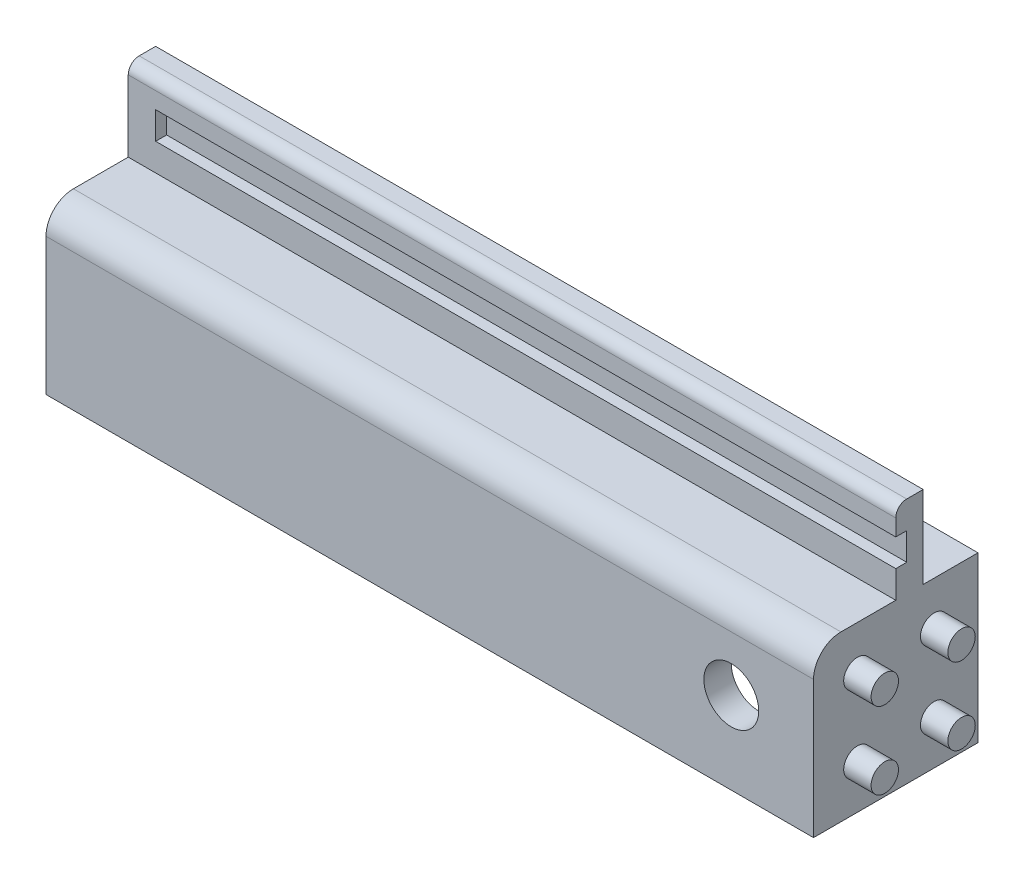
ISO-10303-21;
HEADER;
FILE_DESCRIPTION(('STEP AP214'),'2;1');
FILE_NAME('part.step','',(''),(''),'','','');
FILE_SCHEMA(('AUTOMOTIVE_DESIGN { 1 0 10303 214 1 1 1 1 }'));
ENDSEC;
DATA;
#1=APPLICATION_CONTEXT('core data for automotive mechanical design processes');
#2=APPLICATION_PROTOCOL_DEFINITION('international standard','automotive_design',2000,#1);
#3=PRODUCT_CONTEXT('',#1,'mechanical');
#4=PRODUCT('Part','Part','',(#3));
#5=PRODUCT_RELATED_PRODUCT_CATEGORY('part','',(#4));
#6=PRODUCT_DEFINITION_FORMATION('','',#4);
#7=PRODUCT_DEFINITION_CONTEXT('part definition',#1,'design');
#8=PRODUCT_DEFINITION('design','',#6,#7);
#9=PRODUCT_DEFINITION_SHAPE('','',#8);
#10=(LENGTH_UNIT() NAMED_UNIT(*) SI_UNIT(.MILLI.,.METRE.));
#11=(NAMED_UNIT(*) PLANE_ANGLE_UNIT() SI_UNIT($,.RADIAN.));
#12=(NAMED_UNIT(*) SI_UNIT($,.STERADIAN.) SOLID_ANGLE_UNIT());
#13=UNCERTAINTY_MEASURE_WITH_UNIT(LENGTH_MEASURE(1.E-05),#10,'distance_accuracy_value','');
#14=(GEOMETRIC_REPRESENTATION_CONTEXT(3) GLOBAL_UNCERTAINTY_ASSIGNED_CONTEXT((#13)) GLOBAL_UNIT_ASSIGNED_CONTEXT((#10,
#11,#12)) REPRESENTATION_CONTEXT('',''));
#15=CARTESIAN_POINT('',(0.,0.,0.));
#16=DIRECTION('',(0.,0.,1.));
#17=DIRECTION('',(1.,0.,0.));
#18=AXIS2_PLACEMENT_3D('',#15,#16,#17);
#19=CARTESIAN_POINT('',(0.,30.,0.));
#20=DIRECTION('',(0.,1.,0.));
#21=DIRECTION('',(0.,0.,1.));
#22=AXIS2_PLACEMENT_3D('',#19,#20,#21);
#23=PLANE('',#22);
#24=DIRECTION('',(-1.,0.,0.));
#25=VECTOR('',#24,1.);
#26=CARTESIAN_POINT('',(0.,30.,-20.));
#27=LINE('',#26,#25);
#28=CARTESIAN_POINT('',(140.,30.,-20.));
#29=VERTEX_POINT('',#28);
#30=CARTESIAN_POINT('',(0.,30.,-20.));
#31=VERTEX_POINT('',#30);
#32=EDGE_CURVE('E228',#29,#31,#27,.T.);
#33=ORIENTED_EDGE('',*,*,#32,.F.);
#34=DIRECTION('',(0.,0.,-1.));
#35=VECTOR('',#34,1.);
#36=CARTESIAN_POINT('',(140.,30.,0.));
#37=LINE('',#36,#35);
#38=CARTESIAN_POINT('',(140.,30.,-30.));
#39=VERTEX_POINT('',#38);
#40=EDGE_CURVE('E335',#29,#39,#37,.T.);
#41=ORIENTED_EDGE('',*,*,#40,.T.);
#42=DIRECTION('',(-1.,0.,0.));
#43=VECTOR('',#42,1.);
#44=CARTESIAN_POINT('',(140.,30.,-30.));
#45=LINE('',#44,#43);
#46=CARTESIAN_POINT('',(0.,30.,-30.));
#47=VERTEX_POINT('',#46);
#48=EDGE_CURVE('E339',#39,#47,#45,.T.);
#49=ORIENTED_EDGE('',*,*,#48,.T.);
#50=DIRECTION('',(0.,0.,1.));
#51=VECTOR('',#50,1.);
#52=CARTESIAN_POINT('',(0.,30.,-30.));
#53=LINE('',#52,#51);
#54=EDGE_CURVE('E333',#47,#31,#53,.T.);
#55=ORIENTED_EDGE('',*,*,#54,.T.);
#56=EDGE_LOOP('',(#33,#41,#49,#55));
#57=FACE_BOUND('',#56,.T.);
#58=ADVANCED_FACE('F33',(#57),#23,.T.);
#59=CARTESIAN_POINT('',(0.,30.,-5.));
#60=DIRECTION('',(0.,0.,-1.));
#61=DIRECTION('',(-1.,0.,0.));
#62=AXIS2_PLACEMENT_3D('',#59,#60,#61);
#63=PLANE('',#62);
#64=DIRECTION('',(1.,0.,0.));
#65=VECTOR('',#64,1.);
#66=CARTESIAN_POINT('',(0.,25.,-5.));
#67=LINE('',#66,#65);
#68=CARTESIAN_POINT('',(5.,25.,-5.));
#69=VERTEX_POINT('',#68);
#70=CARTESIAN_POINT('',(50.,25.,-5.));
#71=VERTEX_POINT('',#70);
#72=EDGE_CURVE('E312',#69,#71,#67,.T.);
#73=ORIENTED_EDGE('',*,*,#72,.T.);
#74=DIRECTION('',(0.,1.,0.));
#75=VECTOR('',#74,1.);
#76=CARTESIAN_POINT('',(50.,0.,-5.));
#77=LINE('',#76,#75);
#78=CARTESIAN_POINT('',(50.,0.,-5.));
#79=VERTEX_POINT('',#78);
#80=EDGE_CURVE('E291',#79,#71,#77,.T.);
#81=ORIENTED_EDGE('',*,*,#80,.F.);
#82=DIRECTION('',(1.,0.,0.));
#83=VECTOR('',#82,1.);
#84=CARTESIAN_POINT('',(0.,0.,-5.));
#85=LINE('',#84,#83);
#86=CARTESIAN_POINT('',(5.,0.,-5.));
#87=VERTEX_POINT('',#86);
#88=EDGE_CURVE('E330',#87,#79,#85,.T.);
#89=ORIENTED_EDGE('',*,*,#88,.F.);
#90=DIRECTION('',(0.,-1.,0.));
#91=VECTOR('',#90,1.);
#92=CARTESIAN_POINT('',(5.,30.,-5.));
#93=LINE('',#92,#91);
#94=EDGE_CURVE('E295',#69,#87,#93,.T.);
#95=ORIENTED_EDGE('',*,*,#94,.F.);
#96=EDGE_LOOP('',(#73,#81,#89,#95));
#97=FACE_BOUND('',#96,.T.);
#98=ADVANCED_FACE('F414',(#97),#63,.T.);
#99=CARTESIAN_POINT('',(125.,15.,-5.));
#100=DIRECTION('',(0.,0.,-1.));
#101=DIRECTION('',(-1.,0.,0.));
#102=AXIS2_PLACEMENT_3D('',#99,#100,#101);
#103=CIRCLE('',#102,4.99999999999999);
#104=CARTESIAN_POINT('',(120.,15.,-5.));
#105=VERTEX_POINT('',#104);
#106=EDGE_CURVE('E256',#105,#105,#103,.T.);
#107=ORIENTED_EDGE('',*,*,#106,.F.);
#108=EDGE_LOOP('',(#107));
#109=FACE_BOUND('',#108,.T.);
#110=CARTESIAN_POINT('',(55.,0.,-5.));
#111=VERTEX_POINT('',#110);
#112=CARTESIAN_POINT('',(135.,0.,-5.));
#113=VERTEX_POINT('',#112);
#114=EDGE_CURVE('E323',#111,#113,#85,.T.);
#115=ORIENTED_EDGE('',*,*,#114,.F.);
#116=DIRECTION('',(0.,1.,0.));
#117=VECTOR('',#116,1.);
#118=CARTESIAN_POINT('',(55.,0.,-5.));
#119=LINE('',#118,#117);
#120=CARTESIAN_POINT('',(55.,25.,-5.));
#121=VERTEX_POINT('',#120);
#122=EDGE_CURVE('E279',#111,#121,#119,.T.);
#123=ORIENTED_EDGE('',*,*,#122,.T.);
#124=CARTESIAN_POINT('',(135.,25.,-5.));
#125=VERTEX_POINT('',#124);
#126=EDGE_CURVE('E303',#121,#125,#67,.T.);
#127=ORIENTED_EDGE('',*,*,#126,.T.);
#128=DIRECTION('',(0.,-1.,0.));
#129=VECTOR('',#128,1.);
#130=CARTESIAN_POINT('',(135.,30.,-5.));
#131=LINE('',#130,#129);
#132=EDGE_CURVE('E299',#125,#113,#131,.T.);
#133=ORIENTED_EDGE('',*,*,#132,.T.);
#134=EDGE_LOOP('',(#115,#123,#127,#133));
#135=FACE_BOUND('',#134,.T.);
#136=ADVANCED_FACE('F420',(#109,#135),#63,.T.);
#137=CARTESIAN_POINT('',(140.,30.,-25.));
#138=DIRECTION('',(0.,0.,1.));
#139=DIRECTION('',(1.,0.,0.));
#140=AXIS2_PLACEMENT_3D('',#137,#138,#139);
#141=PLANE('',#140);
#142=DIRECTION('',(-1.,0.,0.));
#143=VECTOR('',#142,1.);
#144=CARTESIAN_POINT('',(140.,0.,-25.));
#145=LINE('',#144,#143);
#146=CARTESIAN_POINT('',(50.,0.,-25.));
#147=VERTEX_POINT('',#146);
#148=CARTESIAN_POINT('',(5.,0.,-25.));
#149=VERTEX_POINT('',#148);
#150=EDGE_CURVE('E326',#147,#149,#145,.T.);
#151=ORIENTED_EDGE('',*,*,#150,.F.);
#152=DIRECTION('',(0.,1.,0.));
#153=VECTOR('',#152,1.);
#154=CARTESIAN_POINT('',(50.,0.,-25.));
#155=LINE('',#154,#153);
#156=CARTESIAN_POINT('',(50.,25.,-25.));
#157=VERTEX_POINT('',#156);
#158=EDGE_CURVE('E289',#147,#157,#155,.T.);
#159=ORIENTED_EDGE('',*,*,#158,.T.);
#160=DIRECTION('',(-1.,0.,0.));
#161=VECTOR('',#160,1.);
#162=CARTESIAN_POINT('',(140.,25.,-25.));
#163=LINE('',#162,#161);
#164=CARTESIAN_POINT('',(5.,25.,-25.));
#165=VERTEX_POINT('',#164);
#166=EDGE_CURVE('E318',#157,#165,#163,.T.);
#167=ORIENTED_EDGE('',*,*,#166,.T.);
#168=DIRECTION('',(0.,-1.,0.));
#169=VECTOR('',#168,1.);
#170=CARTESIAN_POINT('',(5.,30.,-25.));
#171=LINE('',#170,#169);
#172=EDGE_CURVE('E305',#165,#149,#171,.T.);
#173=ORIENTED_EDGE('',*,*,#172,.T.);
#174=EDGE_LOOP('',(#151,#159,#167,#173));
#175=FACE_BOUND('',#174,.T.);
#176=ADVANCED_FACE('F552',(#175),#141,.T.);
#177=CARTESIAN_POINT('',(125.,15.,-25.));
#178=DIRECTION('',(0.,0.,1.));
#179=DIRECTION('',(1.,0.,0.));
#180=AXIS2_PLACEMENT_3D('',#177,#178,#179);
#181=CIRCLE('',#180,4.99999999999999);
#182=CARTESIAN_POINT('',(130.,15.,-25.));
#183=VERTEX_POINT('',#182);
#184=EDGE_CURVE('E253',#183,#183,#181,.T.);
#185=ORIENTED_EDGE('',*,*,#184,.F.);
#186=EDGE_LOOP('',(#185));
#187=FACE_BOUND('',#186,.T.);
#188=CARTESIAN_POINT('',(135.,25.,-25.));
#189=VERTEX_POINT('',#188);
#190=CARTESIAN_POINT('',(55.,25.,-25.));
#191=VERTEX_POINT('',#190);
#192=EDGE_CURVE('E309',#189,#191,#163,.T.);
#193=ORIENTED_EDGE('',*,*,#192,.T.);
#194=DIRECTION('',(0.,1.,0.));
#195=VECTOR('',#194,1.);
#196=CARTESIAN_POINT('',(55.,0.,-25.));
#197=LINE('',#196,#195);
#198=CARTESIAN_POINT('',(55.,0.,-25.));
#199=VERTEX_POINT('',#198);
#200=EDGE_CURVE('E286',#199,#191,#197,.T.);
#201=ORIENTED_EDGE('',*,*,#200,.F.);
#202=CARTESIAN_POINT('',(135.,0.,-25.));
#203=VERTEX_POINT('',#202);
#204=EDGE_CURVE('E304',#203,#199,#145,.T.);
#205=ORIENTED_EDGE('',*,*,#204,.F.);
#206=DIRECTION('',(0.,-1.,0.));
#207=VECTOR('',#206,1.);
#208=CARTESIAN_POINT('',(135.,30.,-25.));
#209=LINE('',#208,#207);
#210=EDGE_CURVE('E308',#189,#203,#209,.T.);
#211=ORIENTED_EDGE('',*,*,#210,.F.);
#212=EDGE_LOOP('',(#193,#201,#205,#211));
#213=FACE_BOUND('',#212,.T.);
#214=ADVANCED_FACE('F554',(#187,#213),#141,.T.);
#215=CARTESIAN_POINT('',(0.,25.,0.));
#216=DIRECTION('',(0.,1.,0.));
#217=DIRECTION('',(0.,0.,1.));
#218=AXIS2_PLACEMENT_3D('',#215,#216,#217);
#219=PLANE('',#218);
#220=DIRECTION('',(0.,0.,-1.));
#221=VECTOR('',#220,1.);
#222=CARTESIAN_POINT('',(50.,25.,-5.));
#223=LINE('',#222,#221);
#224=EDGE_CURVE('E271',#71,#157,#223,.T.);
#225=ORIENTED_EDGE('',*,*,#224,.F.);
#226=ORIENTED_EDGE('',*,*,#72,.F.);
#227=DIRECTION('',(0.,0.,1.));
#228=VECTOR('',#227,1.);
#229=CARTESIAN_POINT('',(5.,25.,-30.));
#230=LINE('',#229,#228);
#231=EDGE_CURVE('E300',#165,#69,#230,.T.);
#232=ORIENTED_EDGE('',*,*,#231,.F.);
#233=ORIENTED_EDGE('',*,*,#166,.F.);
#234=EDGE_LOOP('',(#225,#226,#232,#233));
#235=FACE_BOUND('',#234,.T.);
#236=ADVANCED_FACE('F556',(#235),#219,.F.);
#237=DIRECTION('',(0.,0.,1.));
#238=VECTOR('',#237,1.);
#239=CARTESIAN_POINT('',(55.,25.,-25.));
#240=LINE('',#239,#238);
#241=EDGE_CURVE('E276',#191,#121,#240,.T.);
#242=ORIENTED_EDGE('',*,*,#241,.F.);
#243=ORIENTED_EDGE('',*,*,#192,.F.);
#244=DIRECTION('',(0.,0.,-1.));
#245=VECTOR('',#244,1.);
#246=CARTESIAN_POINT('',(135.,25.,0.));
#247=LINE('',#246,#245);
#248=EDGE_CURVE('E315',#125,#189,#247,.T.);
#249=ORIENTED_EDGE('',*,*,#248,.F.);
#250=ORIENTED_EDGE('',*,*,#126,.F.);
#251=EDGE_LOOP('',(#242,#243,#249,#250));
#252=FACE_BOUND('',#251,.T.);
#253=ADVANCED_FACE('F448',(#252),#219,.F.);
#254=CARTESIAN_POINT('',(0.,30.,-30.));
#255=DIRECTION('',(1.,0.,0.));
#256=DIRECTION('',(0.,0.,-1.));
#257=AXIS2_PLACEMENT_3D('',#254,#255,#256);
#258=PLANE('',#257);
#259=CARTESIAN_POINT('',(0.,15.,-15.));
#260=DIRECTION('',(-1.,0.,0.));
#261=DIRECTION('',(0.,0.,1.));
#262=AXIS2_PLACEMENT_3D('',#259,#260,#261);
#263=CIRCLE('',#262,5.2);
#264=CARTESIAN_POINT('',(0.,15.,-9.8));
#265=VERTEX_POINT('',#264);
#266=EDGE_CURVE('E820',#265,#265,#263,.T.);
#267=ORIENTED_EDGE('',*,*,#266,.F.);
#268=EDGE_LOOP('',(#267));
#269=FACE_BOUND('',#268,.T.);
#270=DIRECTION('',(0.,-1.,0.));
#271=VECTOR('',#270,1.);
#272=CARTESIAN_POINT('',(0.,30.,0.));
#273=LINE('',#272,#271);
#274=CARTESIAN_POINT('',(0.,25.,0.));
#275=VERTEX_POINT('',#274);
#276=CARTESIAN_POINT('',(0.,0.,0.));
#277=VERTEX_POINT('',#276);
#278=EDGE_CURVE('E358',#275,#277,#273,.T.);
#279=ORIENTED_EDGE('',*,*,#278,.F.);
#280=CARTESIAN_POINT('',(0.,25.,-5.));
#281=DIRECTION('',(1.,0.,0.));
#282=DIRECTION('',(0.,0.,-1.));
#283=AXIS2_PLACEMENT_3D('',#280,#281,#282);
#284=CIRCLE('',#283,5.);
#285=CARTESIAN_POINT('',(0.,30.,-5.));
#286=VERTEX_POINT('',#285);
#287=EDGE_CURVE('E11',#275,#286,#284,.F.);
#288=ORIENTED_EDGE('',*,*,#287,.T.);
#289=CARTESIAN_POINT('',(0.,30.,-15.));
#290=VERTEX_POINT('',#289);
#291=EDGE_CURVE('E336',#290,#286,#53,.T.);
#292=ORIENTED_EDGE('',*,*,#291,.F.);
#293=DIRECTION('',(0.,-1.,0.));
#294=VECTOR('',#293,1.);
#295=CARTESIAN_POINT('',(0.,45.,-15.));
#296=LINE('',#295,#294);
#297=CARTESIAN_POINT('',(0.,43.,-15.));
#298=VERTEX_POINT('',#297);
#299=EDGE_CURVE('E245',#298,#290,#296,.T.);
#300=ORIENTED_EDGE('',*,*,#299,.F.);
#301=CARTESIAN_POINT('',(0.,43.,-17.));
#302=DIRECTION('',(1.,0.,0.));
#303=DIRECTION('',(0.,0.,-1.));
#304=AXIS2_PLACEMENT_3D('',#301,#302,#303);
#305=CIRCLE('',#304,2.);
#306=CARTESIAN_POINT('',(0.,45.,-17.));
#307=VERTEX_POINT('',#306);
#308=EDGE_CURVE('E379',#298,#307,#305,.F.);
#309=ORIENTED_EDGE('',*,*,#308,.T.);
#310=DIRECTION('',(0.,0.,1.));
#311=VECTOR('',#310,1.);
#312=CARTESIAN_POINT('',(0.,45.,-20.));
#313=LINE('',#312,#311);
#314=CARTESIAN_POINT('',(0.,45.,-20.));
#315=VERTEX_POINT('',#314);
#316=EDGE_CURVE('E224',#315,#307,#313,.T.);
#317=ORIENTED_EDGE('',*,*,#316,.F.);
#318=DIRECTION('',(0.,-1.,0.));
#319=VECTOR('',#318,1.);
#320=CARTESIAN_POINT('',(0.,45.,-20.));
#321=LINE('',#320,#319);
#322=EDGE_CURVE('E232',#315,#31,#321,.T.);
#323=ORIENTED_EDGE('',*,*,#322,.T.);
#324=ORIENTED_EDGE('',*,*,#54,.F.);
#325=DIRECTION('',(0.,-1.,0.));
#326=VECTOR('',#325,1.);
#327=CARTESIAN_POINT('',(0.,30.,-30.));
#328=LINE('',#327,#326);
#329=CARTESIAN_POINT('',(0.,0.,-30.));
#330=VERTEX_POINT('',#329);
#331=EDGE_CURVE('E341',#47,#330,#328,.T.);
#332=ORIENTED_EDGE('',*,*,#331,.T.);
#333=DIRECTION('',(0.,0.,1.));
#334=VECTOR('',#333,1.);
#335=CARTESIAN_POINT('',(0.,0.,-30.));
#336=LINE('',#335,#334);
#337=EDGE_CURVE('E298',#330,#277,#336,.T.);
#338=ORIENTED_EDGE('',*,*,#337,.T.);
#339=EDGE_LOOP('',(#279,#288,#292,#300,#309,#317,#323,#324,#332,#338));
#340=FACE_BOUND('',#339,.T.);
#341=ADVANCED_FACE('F403',(#269,#340),#258,.F.);
#342=CARTESIAN_POINT('',(0.,30.,0.));
#343=DIRECTION('',(0.,0.,-1.));
#344=DIRECTION('',(-1.,0.,0.));
#345=AXIS2_PLACEMENT_3D('',#342,#343,#344);
#346=PLANE('',#345);
#347=CARTESIAN_POINT('',(125.,15.,0.));
#348=DIRECTION('',(0.,0.,-1.));
#349=DIRECTION('',(-1.,0.,0.));
#350=AXIS2_PLACEMENT_3D('',#347,#348,#349);
#351=CIRCLE('',#350,4.99999999999999);
#352=CARTESIAN_POINT('',(120.,15.,0.));
#353=VERTEX_POINT('',#352);
#354=EDGE_CURVE('E250',#353,#353,#351,.T.);
#355=ORIENTED_EDGE('',*,*,#354,.T.);
#356=EDGE_LOOP('',(#355));
#357=FACE_BOUND('',#356,.T.);
#358=DIRECTION('',(0.,-1.,0.));
#359=VECTOR('',#358,1.);
#360=CARTESIAN_POINT('',(140.,30.,0.));
#361=LINE('',#360,#359);
#362=CARTESIAN_POINT('',(140.,25.,0.));
#363=VERTEX_POINT('',#362);
#364=CARTESIAN_POINT('',(140.,0.,0.));
#365=VERTEX_POINT('',#364);
#366=EDGE_CURVE('E356',#363,#365,#361,.T.);
#367=ORIENTED_EDGE('',*,*,#366,.F.);
#368=DIRECTION('',(1.,0.,0.));
#369=VECTOR('',#368,1.);
#370=CARTESIAN_POINT('',(0.,25.,0.));
#371=LINE('',#370,#369);
#372=EDGE_CURVE('E41',#363,#275,#371,.F.);
#373=ORIENTED_EDGE('',*,*,#372,.T.);
#374=ORIENTED_EDGE('',*,*,#278,.T.);
#375=DIRECTION('',(1.,0.,0.));
#376=VECTOR('',#375,1.);
#377=CARTESIAN_POINT('',(0.,0.,0.));
#378=LINE('',#377,#376);
#379=EDGE_CURVE('E344',#277,#365,#378,.T.);
#380=ORIENTED_EDGE('',*,*,#379,.T.);
#381=EDGE_LOOP('',(#367,#373,#374,#380));
#382=FACE_BOUND('',#381,.T.);
#383=ADVANCED_FACE('F440',(#357,#382),#346,.F.);
#384=CARTESIAN_POINT('',(140.,30.,0.));
#385=DIRECTION('',(-1.,0.,0.));
#386=DIRECTION('',(0.,0.,1.));
#387=AXIS2_PLACEMENT_3D('',#384,#385,#386);
#388=PLANE('',#387);
#389=CARTESIAN_POINT('',(140.,30.,-5.));
#390=VERTEX_POINT('',#389);
#391=CARTESIAN_POINT('',(140.,30.,-15.));
#392=VERTEX_POINT('',#391);
#393=EDGE_CURVE('E337',#390,#392,#37,.T.);
#394=ORIENTED_EDGE('',*,*,#393,.F.);
#395=CARTESIAN_POINT('',(140.,25.,-5.));
#396=DIRECTION('',(-1.,0.,0.));
#397=DIRECTION('',(0.,0.,1.));
#398=AXIS2_PLACEMENT_3D('',#395,#396,#397);
#399=CIRCLE('',#398,5.);
#400=EDGE_CURVE('E55',#390,#363,#399,.F.);
#401=ORIENTED_EDGE('',*,*,#400,.T.);
#402=ORIENTED_EDGE('',*,*,#366,.T.);
#403=DIRECTION('',(0.,0.,-1.));
#404=VECTOR('',#403,1.);
#405=CARTESIAN_POINT('',(140.,0.,0.));
#406=LINE('',#405,#404);
#407=CARTESIAN_POINT('',(140.,0.,-30.));
#408=VERTEX_POINT('',#407);
#409=EDGE_CURVE('E347',#365,#408,#406,.T.);
#410=ORIENTED_EDGE('',*,*,#409,.T.);
#411=DIRECTION('',(0.,-1.,0.));
#412=VECTOR('',#411,1.);
#413=CARTESIAN_POINT('',(140.,30.,-30.));
#414=LINE('',#413,#412);
#415=EDGE_CURVE('E353',#39,#408,#414,.T.);
#416=ORIENTED_EDGE('',*,*,#415,.F.);
#417=ORIENTED_EDGE('',*,*,#40,.F.);
#418=DIRECTION('',(0.,-1.,0.));
#419=VECTOR('',#418,1.);
#420=CARTESIAN_POINT('',(140.,45.,-20.));
#421=LINE('',#420,#419);
#422=CARTESIAN_POINT('',(140.,45.,-20.));
#423=VERTEX_POINT('',#422);
#424=EDGE_CURVE('E239',#423,#29,#421,.T.);
#425=ORIENTED_EDGE('',*,*,#424,.F.);
#426=DIRECTION('',(0.,0.,-1.));
#427=VECTOR('',#426,1.);
#428=CARTESIAN_POINT('',(140.,45.,-20.));
#429=LINE('',#428,#427);
#430=CARTESIAN_POINT('',(140.,45.,-17.));
#431=VERTEX_POINT('',#430);
#432=EDGE_CURVE('E227',#431,#423,#429,.T.);
#433=ORIENTED_EDGE('',*,*,#432,.F.);
#434=CARTESIAN_POINT('',(140.,43.,-17.));
#435=DIRECTION('',(-1.,0.,0.));
#436=DIRECTION('',(0.,0.,1.));
#437=AXIS2_PLACEMENT_3D('',#434,#435,#436);
#438=CIRCLE('',#437,2.);
#439=CARTESIAN_POINT('',(140.,43.,-15.));
#440=VERTEX_POINT('',#439);
#441=EDGE_CURVE('E375',#431,#440,#438,.F.);
#442=ORIENTED_EDGE('',*,*,#441,.T.);
#443=DIRECTION('',(0.,-1.,0.));
#444=VECTOR('',#443,1.);
#445=CARTESIAN_POINT('',(140.,45.,-15.));
#446=LINE('',#445,#444);
#447=CARTESIAN_POINT('',(140.,40.,-15.));
#448=VERTEX_POINT('',#447);
#449=EDGE_CURVE('E243',#440,#448,#446,.T.);
#450=ORIENTED_EDGE('',*,*,#449,.T.);
#451=DIRECTION('',(0.,0.,1.));
#452=VECTOR('',#451,1.);
#453=CARTESIAN_POINT('',(140.,40.,-17.));
#454=LINE('',#453,#452);
#455=CARTESIAN_POINT('',(140.,40.,-17.));
#456=VERTEX_POINT('',#455);
#457=EDGE_CURVE('E220',#456,#448,#454,.T.);
#458=ORIENTED_EDGE('',*,*,#457,.F.);
#459=DIRECTION('',(0.,1.,0.));
#460=VECTOR('',#459,1.);
#461=CARTESIAN_POINT('',(140.,40.,-17.));
#462=LINE('',#461,#460);
#463=CARTESIAN_POINT('',(140.,35.,-17.));
#464=VERTEX_POINT('',#463);
#465=EDGE_CURVE('E199',#464,#456,#462,.T.);
#466=ORIENTED_EDGE('',*,*,#465,.F.);
#467=DIRECTION('',(0.,0.,1.));
#468=VECTOR('',#467,1.);
#469=CARTESIAN_POINT('',(140.,35.,-17.));
#470=LINE('',#469,#468);
#471=CARTESIAN_POINT('',(140.,35.,-15.));
#472=VERTEX_POINT('',#471);
#473=EDGE_CURVE('E190',#464,#472,#470,.T.);
#474=ORIENTED_EDGE('',*,*,#473,.T.);
#475=EDGE_CURVE('E242',#472,#392,#446,.T.);
#476=ORIENTED_EDGE('',*,*,#475,.T.);
#477=EDGE_LOOP('',(#394,#401,#402,#410,#416,#417,#425,#433,#442,#450,#458,#466,#474,#476));
#478=FACE_BOUND('',#477,.T.);
#479=CARTESIAN_POINT('',(140.,8.,-22.));
#480=DIRECTION('',(-1.,0.,0.));
#481=DIRECTION('',(0.,0.,1.));
#482=AXIS2_PLACEMENT_3D('',#479,#480,#481);
#483=CIRCLE('',#482,2.5);
#484=CARTESIAN_POINT('',(140.,8.,-19.5));
#485=VERTEX_POINT('',#484);
#486=EDGE_CURVE('E369',#485,#485,#483,.F.);
#487=ORIENTED_EDGE('',*,*,#486,.F.);
#488=EDGE_LOOP('',(#487));
#489=FACE_BOUND('',#488,.T.);
#490=CARTESIAN_POINT('',(140.,8.,-8.));
#491=DIRECTION('',(-1.,0.,0.));
#492=DIRECTION('',(0.,0.,1.));
#493=AXIS2_PLACEMENT_3D('',#490,#491,#492);
#494=CIRCLE('',#493,2.5);
#495=CARTESIAN_POINT('',(140.,8.,-5.5));
#496=VERTEX_POINT('',#495);
#497=EDGE_CURVE('E366',#496,#496,#494,.F.);
#498=ORIENTED_EDGE('',*,*,#497,.F.);
#499=EDGE_LOOP('',(#498));
#500=FACE_BOUND('',#499,.T.);
#501=CARTESIAN_POINT('',(140.,22.,-22.));
#502=DIRECTION('',(-1.,0.,0.));
#503=DIRECTION('',(0.,0.,1.));
#504=AXIS2_PLACEMENT_3D('',#501,#502,#503);
#505=CIRCLE('',#504,2.5);
#506=CARTESIAN_POINT('',(140.,22.,-19.5));
#507=VERTEX_POINT('',#506);
#508=EDGE_CURVE('E363',#507,#507,#505,.F.);
#509=ORIENTED_EDGE('',*,*,#508,.F.);
#510=EDGE_LOOP('',(#509));
#511=FACE_BOUND('',#510,.T.);
#512=CARTESIAN_POINT('',(140.,22.,-8.));
#513=DIRECTION('',(-1.,0.,0.));
#514=DIRECTION('',(0.,0.,1.));
#515=AXIS2_PLACEMENT_3D('',#512,#513,#514);
#516=CIRCLE('',#515,2.5);
#517=CARTESIAN_POINT('',(140.,22.,-5.5));
#518=VERTEX_POINT('',#517);
#519=EDGE_CURVE('E360',#518,#518,#516,.F.);
#520=ORIENTED_EDGE('',*,*,#519,.F.);
#521=EDGE_LOOP('',(#520));
#522=FACE_BOUND('',#521,.T.);
#523=ADVANCED_FACE('F395',(#478,#489,#500,#511,#522),#388,.F.);
#524=CARTESIAN_POINT('',(140.,30.,-30.));
#525=DIRECTION('',(0.,0.,1.));
#526=DIRECTION('',(1.,0.,0.));
#527=AXIS2_PLACEMENT_3D('',#524,#525,#526);
#528=PLANE('',#527);
#529=CARTESIAN_POINT('',(125.,15.,-30.));
#530=DIRECTION('',(0.,0.,1.));
#531=DIRECTION('',(1.,0.,0.));
#532=AXIS2_PLACEMENT_3D('',#529,#530,#531);
#533=CIRCLE('',#532,4.99999999999999);
#534=CARTESIAN_POINT('',(130.,15.,-30.));
#535=VERTEX_POINT('',#534);
#536=EDGE_CURVE('E247',#535,#535,#533,.T.);
#537=ORIENTED_EDGE('',*,*,#536,.T.);
#538=EDGE_LOOP('',(#537));
#539=FACE_BOUND('',#538,.T.);
#540=DIRECTION('',(-1.,0.,0.));
#541=VECTOR('',#540,1.);
#542=CARTESIAN_POINT('',(140.,0.,-30.));
#543=LINE('',#542,#541);
#544=EDGE_CURVE('E349',#408,#330,#543,.T.);
#545=ORIENTED_EDGE('',*,*,#544,.T.);
#546=ORIENTED_EDGE('',*,*,#331,.F.);
#547=ORIENTED_EDGE('',*,*,#48,.F.);
#548=ORIENTED_EDGE('',*,*,#415,.T.);
#549=EDGE_LOOP('',(#545,#546,#547,#548));
#550=FACE_BOUND('',#549,.T.);
#551=ADVANCED_FACE('F427',(#539,#550),#528,.F.);
#552=ORIENTED_EDGE('',*,*,#291,.T.);
#553=DIRECTION('',(1.,0.,0.));
#554=VECTOR('',#553,1.);
#555=CARTESIAN_POINT('',(140.,30.,-5.));
#556=LINE('',#555,#554);
#557=EDGE_CURVE('E381',#286,#390,#556,.T.);
#558=ORIENTED_EDGE('',*,*,#557,.T.);
#559=ORIENTED_EDGE('',*,*,#393,.T.);
#560=DIRECTION('',(1.,0.,0.));
#561=VECTOR('',#560,1.);
#562=CARTESIAN_POINT('',(0.,30.,-15.));
#563=LINE('',#562,#561);
#564=EDGE_CURVE('E219',#290,#392,#563,.T.);
#565=ORIENTED_EDGE('',*,*,#564,.F.);
#566=EDGE_LOOP('',(#552,#558,#559,#565));
#567=FACE_BOUND('',#566,.T.);
#568=ADVANCED_FACE('F389',(#567),#23,.T.);
#569=CARTESIAN_POINT('',(0.,0.,0.));
#570=DIRECTION('',(0.,1.,0.));
#571=DIRECTION('',(0.,0.,1.));
#572=AXIS2_PLACEMENT_3D('',#569,#570,#571);
#573=PLANE('',#572);
#574=ORIENTED_EDGE('',*,*,#88,.T.);
#575=DIRECTION('',(0.,0.,-1.));
#576=VECTOR('',#575,1.);
#577=CARTESIAN_POINT('',(50.,0.,-5.));
#578=LINE('',#577,#576);
#579=EDGE_CURVE('E272',#79,#147,#578,.T.);
#580=ORIENTED_EDGE('',*,*,#579,.T.);
#581=ORIENTED_EDGE('',*,*,#150,.T.);
#582=DIRECTION('',(0.,0.,1.));
#583=VECTOR('',#582,1.);
#584=CARTESIAN_POINT('',(5.,0.,-30.));
#585=LINE('',#584,#583);
#586=EDGE_CURVE('E294',#149,#87,#585,.T.);
#587=ORIENTED_EDGE('',*,*,#586,.T.);
#588=EDGE_LOOP('',(#574,#580,#581,#587));
#589=FACE_BOUND('',#588,.T.);
#590=ORIENTED_EDGE('',*,*,#204,.T.);
#591=DIRECTION('',(0.,0.,1.));
#592=VECTOR('',#591,1.);
#593=CARTESIAN_POINT('',(55.,0.,-25.));
#594=LINE('',#593,#592);
#595=EDGE_CURVE('E275',#199,#111,#594,.T.);
#596=ORIENTED_EDGE('',*,*,#595,.T.);
#597=ORIENTED_EDGE('',*,*,#114,.T.);
#598=DIRECTION('',(0.,0.,-1.));
#599=VECTOR('',#598,1.);
#600=CARTESIAN_POINT('',(135.,0.,0.));
#601=LINE('',#600,#599);
#602=EDGE_CURVE('E327',#113,#203,#601,.T.);
#603=ORIENTED_EDGE('',*,*,#602,.T.);
#604=EDGE_LOOP('',(#590,#596,#597,#603));
#605=FACE_BOUND('',#604,.T.);
#606=ORIENTED_EDGE('',*,*,#337,.F.);
#607=ORIENTED_EDGE('',*,*,#544,.F.);
#608=ORIENTED_EDGE('',*,*,#409,.F.);
#609=ORIENTED_EDGE('',*,*,#379,.F.);
#610=EDGE_LOOP('',(#606,#607,#608,#609));
#611=FACE_BOUND('',#610,.T.);
#612=ADVANCED_FACE('F426',(#589,#605,#611),#573,.F.);
#613=CARTESIAN_POINT('',(5.,30.,-30.));
#614=DIRECTION('',(1.,0.,0.));
#615=DIRECTION('',(0.,0.,-1.));
#616=AXIS2_PLACEMENT_3D('',#613,#614,#615);
#617=PLANE('',#616);
#618=CARTESIAN_POINT('',(5.,15.,-15.));
#619=DIRECTION('',(1.,0.,0.));
#620=DIRECTION('',(0.,0.,-1.));
#621=AXIS2_PLACEMENT_3D('',#618,#619,#620);
#622=CIRCLE('',#621,2.74999999999999);
#623=CARTESIAN_POINT('',(5.,15.,-17.75));
#624=VERTEX_POINT('',#623);
#625=EDGE_CURVE('E215',#624,#624,#622,.T.);
#626=ORIENTED_EDGE('',*,*,#625,.F.);
#627=EDGE_LOOP('',(#626));
#628=FACE_BOUND('',#627,.T.);
#629=ORIENTED_EDGE('',*,*,#586,.F.);
#630=ORIENTED_EDGE('',*,*,#172,.F.);
#631=ORIENTED_EDGE('',*,*,#231,.T.);
#632=ORIENTED_EDGE('',*,*,#94,.T.);
#633=EDGE_LOOP('',(#629,#630,#631,#632));
#634=FACE_BOUND('',#633,.T.);
#635=ADVANCED_FACE('F432',(#628,#634),#617,.T.);
#636=CARTESIAN_POINT('',(135.,30.,0.));
#637=DIRECTION('',(-1.,0.,0.));
#638=DIRECTION('',(0.,0.,1.));
#639=AXIS2_PLACEMENT_3D('',#636,#637,#638);
#640=PLANE('',#639);
#641=ORIENTED_EDGE('',*,*,#602,.F.);
#642=ORIENTED_EDGE('',*,*,#132,.F.);
#643=ORIENTED_EDGE('',*,*,#248,.T.);
#644=ORIENTED_EDGE('',*,*,#210,.T.);
#645=EDGE_LOOP('',(#641,#642,#643,#644));
#646=FACE_BOUND('',#645,.T.);
#647=ADVANCED_FACE('F544',(#646),#640,.T.);
#648=CARTESIAN_POINT('',(50.,0.,-5.));
#649=DIRECTION('',(1.,0.,0.));
#650=DIRECTION('',(0.,0.,-1.));
#651=AXIS2_PLACEMENT_3D('',#648,#649,#650);
#652=PLANE('',#651);
#653=ORIENTED_EDGE('',*,*,#224,.T.);
#654=ORIENTED_EDGE('',*,*,#158,.F.);
#655=ORIENTED_EDGE('',*,*,#579,.F.);
#656=ORIENTED_EDGE('',*,*,#80,.T.);
#657=EDGE_LOOP('',(#653,#654,#655,#656));
#658=FACE_BOUND('',#657,.T.);
#659=ADVANCED_FACE('F540',(#658),#652,.F.);
#660=CARTESIAN_POINT('',(55.,0.,-25.));
#661=DIRECTION('',(-1.,0.,0.));
#662=DIRECTION('',(0.,0.,1.));
#663=AXIS2_PLACEMENT_3D('',#660,#661,#662);
#664=PLANE('',#663);
#665=ORIENTED_EDGE('',*,*,#241,.T.);
#666=ORIENTED_EDGE('',*,*,#122,.F.);
#667=ORIENTED_EDGE('',*,*,#595,.F.);
#668=ORIENTED_EDGE('',*,*,#200,.T.);
#669=EDGE_LOOP('',(#665,#666,#667,#668));
#670=FACE_BOUND('',#669,.T.);
#671=ADVANCED_FACE('F536',(#670),#664,.F.);
#672=CARTESIAN_POINT('',(145.,22.,-8.));
#673=DIRECTION('',(-1.,0.,0.));
#674=DIRECTION('',(0.,0.,1.));
#675=AXIS2_PLACEMENT_3D('',#672,#673,#674);
#676=CYLINDRICAL_SURFACE('',#675,2.5);
#677=CARTESIAN_POINT('',(145.,22.,-8.));
#678=DIRECTION('',(1.,0.,0.));
#679=DIRECTION('',(0.,0.,-1.));
#680=AXIS2_PLACEMENT_3D('',#677,#678,#679);
#681=CIRCLE('',#680,2.5);
#682=CARTESIAN_POINT('',(145.,22.,-10.5));
#683=VERTEX_POINT('',#682);
#684=EDGE_CURVE('E268',#683,#683,#681,.T.);
#685=ORIENTED_EDGE('',*,*,#684,.F.);
#686=EDGE_LOOP('',(#685));
#687=FACE_BOUND('',#686,.T.);
#688=ORIENTED_EDGE('',*,*,#519,.T.);
#689=EDGE_LOOP('',(#688));
#690=FACE_BOUND('',#689,.T.);
#691=ADVANCED_FACE('F532',(#687,#690),#676,.T.);
#692=CARTESIAN_POINT('',(145.,22.,-8.));
#693=DIRECTION('',(1.,0.,0.));
#694=DIRECTION('',(0.,0.,-1.));
#695=AXIS2_PLACEMENT_3D('',#692,#693,#694);
#696=PLANE('',#695);
#697=ORIENTED_EDGE('',*,*,#684,.T.);
#698=EDGE_LOOP('',(#697));
#699=FACE_BOUND('',#698,.T.);
#700=ADVANCED_FACE('F528',(#699),#696,.T.);
#701=CARTESIAN_POINT('',(145.,22.,-22.));
#702=DIRECTION('',(-1.,0.,0.));
#703=DIRECTION('',(0.,0.,1.));
#704=AXIS2_PLACEMENT_3D('',#701,#702,#703);
#705=CYLINDRICAL_SURFACE('',#704,2.5);
#706=CARTESIAN_POINT('',(145.,22.,-22.));
#707=DIRECTION('',(1.,0.,0.));
#708=DIRECTION('',(0.,0.,-1.));
#709=AXIS2_PLACEMENT_3D('',#706,#707,#708);
#710=CIRCLE('',#709,2.5);
#711=CARTESIAN_POINT('',(145.,22.,-24.5));
#712=VERTEX_POINT('',#711);
#713=EDGE_CURVE('E265',#712,#712,#710,.T.);
#714=ORIENTED_EDGE('',*,*,#713,.F.);
#715=EDGE_LOOP('',(#714));
#716=FACE_BOUND('',#715,.T.);
#717=ORIENTED_EDGE('',*,*,#508,.T.);
#718=EDGE_LOOP('',(#717));
#719=FACE_BOUND('',#718,.T.);
#720=ADVANCED_FACE('F524',(#716,#719),#705,.T.);
#721=CARTESIAN_POINT('',(145.,22.,-22.));
#722=DIRECTION('',(1.,0.,0.));
#723=DIRECTION('',(0.,0.,-1.));
#724=AXIS2_PLACEMENT_3D('',#721,#722,#723);
#725=PLANE('',#724);
#726=ORIENTED_EDGE('',*,*,#713,.T.);
#727=EDGE_LOOP('',(#726));
#728=FACE_BOUND('',#727,.T.);
#729=ADVANCED_FACE('F520',(#728),#725,.T.);
#730=CARTESIAN_POINT('',(145.,8.,-8.));
#731=DIRECTION('',(-1.,0.,0.));
#732=DIRECTION('',(0.,0.,1.));
#733=AXIS2_PLACEMENT_3D('',#730,#731,#732);
#734=CYLINDRICAL_SURFACE('',#733,2.5);
#735=CARTESIAN_POINT('',(145.,8.,-8.));
#736=DIRECTION('',(1.,0.,0.));
#737=DIRECTION('',(0.,0.,-1.));
#738=AXIS2_PLACEMENT_3D('',#735,#736,#737);
#739=CIRCLE('',#738,2.5);
#740=CARTESIAN_POINT('',(145.,8.,-10.5));
#741=VERTEX_POINT('',#740);
#742=EDGE_CURVE('E262',#741,#741,#739,.T.);
#743=ORIENTED_EDGE('',*,*,#742,.F.);
#744=EDGE_LOOP('',(#743));
#745=FACE_BOUND('',#744,.T.);
#746=ORIENTED_EDGE('',*,*,#497,.T.);
#747=EDGE_LOOP('',(#746));
#748=FACE_BOUND('',#747,.T.);
#749=ADVANCED_FACE('F516',(#745,#748),#734,.T.);
#750=CARTESIAN_POINT('',(145.,8.,-8.));
#751=DIRECTION('',(1.,0.,0.));
#752=DIRECTION('',(0.,0.,-1.));
#753=AXIS2_PLACEMENT_3D('',#750,#751,#752);
#754=PLANE('',#753);
#755=ORIENTED_EDGE('',*,*,#742,.T.);
#756=EDGE_LOOP('',(#755));
#757=FACE_BOUND('',#756,.T.);
#758=ADVANCED_FACE('F512',(#757),#754,.T.);
#759=CARTESIAN_POINT('',(145.,8.,-22.));
#760=DIRECTION('',(-1.,0.,0.));
#761=DIRECTION('',(0.,0.,1.));
#762=AXIS2_PLACEMENT_3D('',#759,#760,#761);
#763=CYLINDRICAL_SURFACE('',#762,2.5);
#764=CARTESIAN_POINT('',(145.,8.,-22.));
#765=DIRECTION('',(1.,0.,0.));
#766=DIRECTION('',(0.,0.,-1.));
#767=AXIS2_PLACEMENT_3D('',#764,#765,#766);
#768=CIRCLE('',#767,2.5);
#769=CARTESIAN_POINT('',(145.,8.,-24.5));
#770=VERTEX_POINT('',#769);
#771=EDGE_CURVE('E259',#770,#770,#768,.T.);
#772=ORIENTED_EDGE('',*,*,#771,.F.);
#773=EDGE_LOOP('',(#772));
#774=FACE_BOUND('',#773,.T.);
#775=ORIENTED_EDGE('',*,*,#486,.T.);
#776=EDGE_LOOP('',(#775));
#777=FACE_BOUND('',#776,.T.);
#778=ADVANCED_FACE('F508',(#774,#777),#763,.T.);
#779=CARTESIAN_POINT('',(145.,8.,-22.));
#780=DIRECTION('',(1.,0.,0.));
#781=DIRECTION('',(0.,0.,-1.));
#782=AXIS2_PLACEMENT_3D('',#779,#780,#781);
#783=PLANE('',#782);
#784=ORIENTED_EDGE('',*,*,#771,.T.);
#785=EDGE_LOOP('',(#784));
#786=FACE_BOUND('',#785,.T.);
#787=ADVANCED_FACE('F505',(#786),#783,.T.);
#788=CARTESIAN_POINT('',(125.,15.,-30.));
#789=DIRECTION('',(0.,0.,1.));
#790=DIRECTION('',(1.,0.,0.));
#791=AXIS2_PLACEMENT_3D('',#788,#789,#790);
#792=CYLINDRICAL_SURFACE('',#791,4.99999999999999);
#793=ORIENTED_EDGE('',*,*,#184,.T.);
#794=EDGE_LOOP('',(#793));
#795=FACE_BOUND('',#794,.T.);
#796=ORIENTED_EDGE('',*,*,#536,.F.);
#797=EDGE_LOOP('',(#796));
#798=FACE_BOUND('',#797,.T.);
#799=ADVANCED_FACE('F503',(#795,#798),#792,.F.);
#800=ORIENTED_EDGE('',*,*,#106,.T.);
#801=EDGE_LOOP('',(#800));
#802=FACE_BOUND('',#801,.T.);
#803=ORIENTED_EDGE('',*,*,#354,.F.);
#804=EDGE_LOOP('',(#803));
#805=FACE_BOUND('',#804,.T.);
#806=ADVANCED_FACE('F500',(#802,#805),#792,.F.);
#807=CARTESIAN_POINT('',(0.,45.,-15.));
#808=DIRECTION('',(0.,0.,-1.));
#809=DIRECTION('',(-1.,0.,0.));
#810=AXIS2_PLACEMENT_3D('',#807,#808,#809);
#811=PLANE('',#810);
#812=ORIENTED_EDGE('',*,*,#449,.F.);
#813=DIRECTION('',(1.,0.,0.));
#814=VECTOR('',#813,1.);
#815=CARTESIAN_POINT('',(0.,43.,-15.));
#816=LINE('',#815,#814);
#817=EDGE_CURVE('E377',#440,#298,#816,.F.);
#818=ORIENTED_EDGE('',*,*,#817,.T.);
#819=ORIENTED_EDGE('',*,*,#299,.T.);
#820=ORIENTED_EDGE('',*,*,#564,.T.);
#821=ORIENTED_EDGE('',*,*,#475,.F.);
#822=DIRECTION('',(1.,0.,0.));
#823=VECTOR('',#822,1.);
#824=CARTESIAN_POINT('',(5.,35.,-15.));
#825=LINE('',#824,#823);
#826=CARTESIAN_POINT('',(5.,35.,-15.));
#827=VERTEX_POINT('',#826);
#828=EDGE_CURVE('E206',#827,#472,#825,.T.);
#829=ORIENTED_EDGE('',*,*,#828,.F.);
#830=DIRECTION('',(0.,-1.,0.));
#831=VECTOR('',#830,1.);
#832=CARTESIAN_POINT('',(5.,40.,-15.));
#833=LINE('',#832,#831);
#834=CARTESIAN_POINT('',(5.,40.,-15.));
#835=VERTEX_POINT('',#834);
#836=EDGE_CURVE('E187',#835,#827,#833,.T.);
#837=ORIENTED_EDGE('',*,*,#836,.F.);
#838=DIRECTION('',(-1.,0.,0.));
#839=VECTOR('',#838,1.);
#840=CARTESIAN_POINT('',(5.,40.,-15.));
#841=LINE('',#840,#839);
#842=EDGE_CURVE('E203',#448,#835,#841,.T.);
#843=ORIENTED_EDGE('',*,*,#842,.F.);
#844=EDGE_LOOP('',(#812,#818,#819,#820,#821,#829,#837,#843));
#845=FACE_BOUND('',#844,.T.);
#846=ADVANCED_FACE('F400',(#845),#811,.F.);
#847=CARTESIAN_POINT('',(0.,45.,-20.));
#848=DIRECTION('',(0.,0.,1.));
#849=DIRECTION('',(1.,0.,0.));
#850=AXIS2_PLACEMENT_3D('',#847,#848,#849);
#851=PLANE('',#850);
#852=ORIENTED_EDGE('',*,*,#32,.T.);
#853=ORIENTED_EDGE('',*,*,#322,.F.);
#854=DIRECTION('',(-1.,0.,0.));
#855=VECTOR('',#854,1.);
#856=CARTESIAN_POINT('',(0.,45.,-20.));
#857=LINE('',#856,#855);
#858=EDGE_CURVE('E230',#423,#315,#857,.T.);
#859=ORIENTED_EDGE('',*,*,#858,.F.);
#860=ORIENTED_EDGE('',*,*,#424,.T.);
#861=EDGE_LOOP('',(#852,#853,#859,#860));
#862=FACE_BOUND('',#861,.T.);
#863=ADVANCED_FACE('F470',(#862),#851,.F.);
#864=CARTESIAN_POINT('',(0.,45.,0.));
#865=DIRECTION('',(0.,1.,0.));
#866=DIRECTION('',(0.,0.,1.));
#867=AXIS2_PLACEMENT_3D('',#864,#865,#866);
#868=PLANE('',#867);
#869=ORIENTED_EDGE('',*,*,#316,.T.);
#870=DIRECTION('',(1.,0.,0.));
#871=VECTOR('',#870,1.);
#872=CARTESIAN_POINT('',(140.,45.,-17.));
#873=LINE('',#872,#871);
#874=EDGE_CURVE('E372',#307,#431,#873,.T.);
#875=ORIENTED_EDGE('',*,*,#874,.T.);
#876=ORIENTED_EDGE('',*,*,#432,.T.);
#877=ORIENTED_EDGE('',*,*,#858,.T.);
#878=EDGE_LOOP('',(#869,#875,#876,#877));
#879=FACE_BOUND('',#878,.T.);
#880=ADVANCED_FACE('F464',(#879),#868,.T.);
#881=CARTESIAN_POINT('',(5.,40.,-17.));
#882=DIRECTION('',(-1.,0.,0.));
#883=DIRECTION('',(0.,-1.,0.));
#884=AXIS2_PLACEMENT_3D('',#881,#882,#883);
#885=PLANE('',#884);
#886=ORIENTED_EDGE('',*,*,#836,.T.);
#887=DIRECTION('',(0.,0.,1.));
#888=VECTOR('',#887,1.);
#889=CARTESIAN_POINT('',(5.,35.,-17.));
#890=LINE('',#889,#888);
#891=CARTESIAN_POINT('',(5.,35.,-17.));
#892=VERTEX_POINT('',#891);
#893=EDGE_CURVE('E180',#892,#827,#890,.T.);
#894=ORIENTED_EDGE('',*,*,#893,.F.);
#895=DIRECTION('',(0.,-1.,0.));
#896=VECTOR('',#895,1.);
#897=CARTESIAN_POINT('',(5.,40.,-17.));
#898=LINE('',#897,#896);
#899=CARTESIAN_POINT('',(5.,40.,-17.));
#900=VERTEX_POINT('',#899);
#901=EDGE_CURVE('E184',#900,#892,#898,.T.);
#902=ORIENTED_EDGE('',*,*,#901,.F.);
#903=DIRECTION('',(0.,0.,1.));
#904=VECTOR('',#903,1.);
#905=CARTESIAN_POINT('',(5.,40.,-17.));
#906=LINE('',#905,#904);
#907=EDGE_CURVE('E217',#900,#835,#906,.T.);
#908=ORIENTED_EDGE('',*,*,#907,.T.);
#909=EDGE_LOOP('',(#886,#894,#902,#908));
#910=FACE_BOUND('',#909,.T.);
#911=ADVANCED_FACE('F182',(#910),#885,.F.);
#912=CARTESIAN_POINT('',(5.,40.,-17.));
#913=DIRECTION('',(0.,1.,0.));
#914=DIRECTION('',(0.,0.,1.));
#915=AXIS2_PLACEMENT_3D('',#912,#913,#914);
#916=PLANE('',#915);
#917=ORIENTED_EDGE('',*,*,#842,.T.);
#918=ORIENTED_EDGE('',*,*,#907,.F.);
#919=DIRECTION('',(-1.,0.,0.));
#920=VECTOR('',#919,1.);
#921=CARTESIAN_POINT('',(5.,40.,-17.));
#922=LINE('',#921,#920);
#923=EDGE_CURVE('E191',#456,#900,#922,.T.);
#924=ORIENTED_EDGE('',*,*,#923,.F.);
#925=ORIENTED_EDGE('',*,*,#457,.T.);
#926=EDGE_LOOP('',(#917,#918,#924,#925));
#927=FACE_BOUND('',#926,.T.);
#928=ADVANCED_FACE('F484',(#927),#916,.F.);
#929=CARTESIAN_POINT('',(5.,35.,-17.));
#930=DIRECTION('',(0.,-1.,0.));
#931=DIRECTION('',(0.,0.,-1.));
#932=AXIS2_PLACEMENT_3D('',#929,#930,#931);
#933=PLANE('',#932);
#934=ORIENTED_EDGE('',*,*,#828,.T.);
#935=ORIENTED_EDGE('',*,*,#473,.F.);
#936=DIRECTION('',(1.,0.,0.));
#937=VECTOR('',#936,1.);
#938=CARTESIAN_POINT('',(5.,35.,-17.));
#939=LINE('',#938,#937);
#940=EDGE_CURVE('E194',#892,#464,#939,.T.);
#941=ORIENTED_EDGE('',*,*,#940,.F.);
#942=ORIENTED_EDGE('',*,*,#893,.T.);
#943=EDGE_LOOP('',(#934,#935,#941,#942));
#944=FACE_BOUND('',#943,.T.);
#945=ADVANCED_FACE('F195',(#944),#933,.F.);
#946=CARTESIAN_POINT('',(0.,0.,-17.));
#947=DIRECTION('',(0.,0.,1.));
#948=DIRECTION('',(1.,0.,0.));
#949=AXIS2_PLACEMENT_3D('',#946,#947,#948);
#950=PLANE('',#949);
#951=ORIENTED_EDGE('',*,*,#901,.T.);
#952=ORIENTED_EDGE('',*,*,#940,.T.);
#953=ORIENTED_EDGE('',*,*,#465,.T.);
#954=ORIENTED_EDGE('',*,*,#923,.T.);
#955=EDGE_LOOP('',(#951,#952,#953,#954));
#956=FACE_BOUND('',#955,.T.);
#957=ADVANCED_FACE('F201',(#956),#950,.T.);
#958=CARTESIAN_POINT('',(0.,43.,-17.));
#959=DIRECTION('',(-1.,0.,0.));
#960=DIRECTION('',(0.,0.,1.));
#961=AXIS2_PLACEMENT_3D('',#958,#959,#960);
#962=CYLINDRICAL_SURFACE('',#961,2.);
#963=ORIENTED_EDGE('',*,*,#308,.F.);
#964=ORIENTED_EDGE('',*,*,#817,.F.);
#965=ORIENTED_EDGE('',*,*,#441,.F.);
#966=ORIENTED_EDGE('',*,*,#874,.F.);
#967=EDGE_LOOP('',(#963,#964,#965,#966));
#968=FACE_BOUND('',#967,.T.);
#969=ADVANCED_FACE('F450',(#968),#962,.T.);
#970=CARTESIAN_POINT('',(0.,15.,-15.));
#971=DIRECTION('',(-1.,0.,0.));
#972=DIRECTION('',(0.,0.,1.));
#973=AXIS2_PLACEMENT_3D('',#970,#971,#972);
#974=CYLINDRICAL_SURFACE('',#973,2.74999999999999);
#975=ORIENTED_EDGE('',*,*,#625,.T.);
#976=EDGE_LOOP('',(#975));
#977=FACE_BOUND('',#976,.T.);
#978=CARTESIAN_POINT('',(2.45,15.,-15.));
#979=DIRECTION('',(-1.,0.,0.));
#980=DIRECTION('',(0.,0.,1.));
#981=AXIS2_PLACEMENT_3D('',#978,#979,#980);
#982=CIRCLE('',#981,2.75);
#983=CARTESIAN_POINT('',(2.45,15.,-12.25));
#984=VERTEX_POINT('',#983);
#985=EDGE_CURVE('E209',#984,#984,#982,.T.);
#986=ORIENTED_EDGE('',*,*,#985,.T.);
#987=EDGE_LOOP('',(#986));
#988=FACE_BOUND('',#987,.T.);
#989=ADVANCED_FACE('F410',(#977,#988),#974,.F.);
#990=CARTESIAN_POINT('',(0.,15.,-15.));
#991=DIRECTION('',(-1.,0.,0.));
#992=DIRECTION('',(0.,0.,1.));
#993=AXIS2_PLACEMENT_3D('',#990,#991,#992);
#994=CONICAL_SURFACE('',#993,5.2,0.785398163397449);
#995=ORIENTED_EDGE('',*,*,#985,.F.);
#996=EDGE_LOOP('',(#995));
#997=FACE_BOUND('',#996,.T.);
#998=ORIENTED_EDGE('',*,*,#266,.T.);
#999=EDGE_LOOP('',(#998));
#1000=FACE_BOUND('',#999,.T.);
#1001=ADVANCED_FACE('F406',(#997,#1000),#994,.F.);
#1002=CARTESIAN_POINT('',(0.,25.,-5.));
#1003=DIRECTION('',(-1.,0.,0.));
#1004=DIRECTION('',(0.,0.,1.));
#1005=AXIS2_PLACEMENT_3D('',#1002,#1003,#1004);
#1006=CYLINDRICAL_SURFACE('',#1005,5.);
#1007=ORIENTED_EDGE('',*,*,#287,.F.);
#1008=ORIENTED_EDGE('',*,*,#372,.F.);
#1009=ORIENTED_EDGE('',*,*,#400,.F.);
#1010=ORIENTED_EDGE('',*,*,#557,.F.);
#1011=EDGE_LOOP('',(#1007,#1008,#1009,#1010));
#1012=FACE_BOUND('',#1011,.T.);
#1013=ADVANCED_FACE('F35',(#1012),#1006,.T.);
#1014=CLOSED_SHELL('',(#58,#98,#136,#176,#214,#236,#253,#341,#383,#523,#551,#568,#612,#635,#647,
#659,#671,#691,#700,#720,#729,#749,#758,#778,#787,#799,#806,#846,#863,#880,#911,#928,#945,#957,
#969,#989,#1001,#1013));
#1015=MANIFOLD_SOLID_BREP('B2',#1014);
#1016=ADVANCED_BREP_SHAPE_REPRESENTATION('',(#18,#1015),#14);
#1017=SHAPE_DEFINITION_REPRESENTATION(#9,#1016);
ENDSEC;
END-ISO-10303-21;
